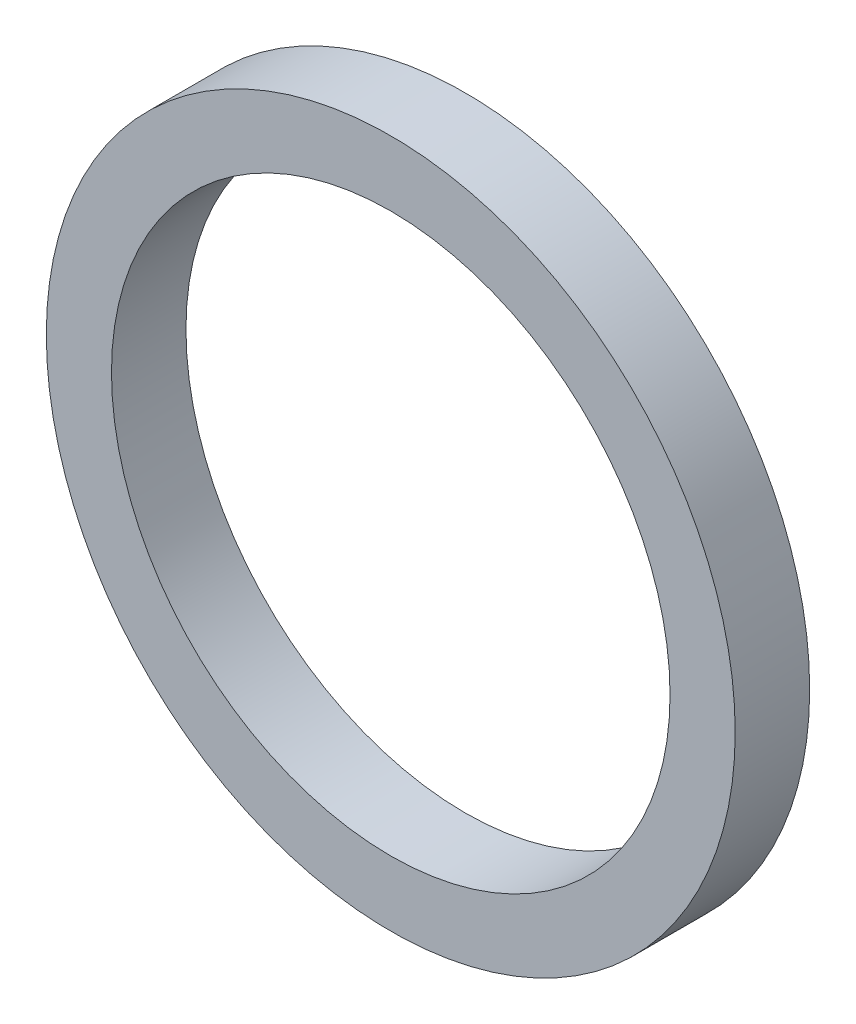
ISO-10303-21;
HEADER;
FILE_DESCRIPTION(('STEP AP214'),'2;1');
FILE_NAME('part.step','',(''),(''),'','','');
FILE_SCHEMA(('AUTOMOTIVE_DESIGN { 1 0 10303 214 1 1 1 1 }'));
ENDSEC;
DATA;
#1=APPLICATION_CONTEXT('core data for automotive mechanical design processes');
#2=APPLICATION_PROTOCOL_DEFINITION('international standard','automotive_design',2000,#1);
#3=PRODUCT_CONTEXT('',#1,'mechanical');
#4=PRODUCT('Part','Part','',(#3));
#5=PRODUCT_RELATED_PRODUCT_CATEGORY('part','',(#4));
#6=PRODUCT_DEFINITION_FORMATION('','',#4);
#7=PRODUCT_DEFINITION_CONTEXT('part definition',#1,'design');
#8=PRODUCT_DEFINITION('design','',#6,#7);
#9=PRODUCT_DEFINITION_SHAPE('','',#8);
#10=(LENGTH_UNIT() NAMED_UNIT(*) SI_UNIT(.MILLI.,.METRE.));
#11=(NAMED_UNIT(*) PLANE_ANGLE_UNIT() SI_UNIT($,.RADIAN.));
#12=(NAMED_UNIT(*) SI_UNIT($,.STERADIAN.) SOLID_ANGLE_UNIT());
#13=UNCERTAINTY_MEASURE_WITH_UNIT(LENGTH_MEASURE(1.E-05),#10,'distance_accuracy_value','');
#14=(GEOMETRIC_REPRESENTATION_CONTEXT(3) GLOBAL_UNCERTAINTY_ASSIGNED_CONTEXT((#13)) GLOBAL_UNIT_ASSIGNED_CONTEXT((#10,
#11,#12)) REPRESENTATION_CONTEXT('',''));
#15=CARTESIAN_POINT('',(0.,0.,0.));
#16=DIRECTION('',(0.,0.,1.));
#17=DIRECTION('',(1.,0.,0.));
#18=AXIS2_PLACEMENT_3D('',#15,#16,#17);
#19=CARTESIAN_POINT('',(0.,0.,4.));
#20=DIRECTION('',(0.,0.,1.));
#21=DIRECTION('',(1.,0.,0.));
#22=AXIS2_PLACEMENT_3D('',#19,#20,#21);
#23=PLANE('',#22);
#24=CARTESIAN_POINT('',(0.,0.,4.));
#25=DIRECTION('',(0.,0.,1.));
#26=DIRECTION('',(1.,0.,0.));
#27=AXIS2_PLACEMENT_3D('',#24,#25,#26);
#28=CIRCLE('',#27,18.5);
#29=CARTESIAN_POINT('',(18.5,0.,4.));
#30=VERTEX_POINT('',#29);
#31=EDGE_CURVE('E10',#30,#30,#28,.T.);
#32=ORIENTED_EDGE('',*,*,#31,.T.);
#33=EDGE_LOOP('',(#32));
#34=FACE_BOUND('',#33,.T.);
#35=CARTESIAN_POINT('',(0.,0.,4.));
#36=DIRECTION('',(0.,0.,1.));
#37=DIRECTION('',(1.,0.,0.));
#38=AXIS2_PLACEMENT_3D('',#35,#36,#37);
#39=CIRCLE('',#38,15.);
#40=CARTESIAN_POINT('',(15.,0.,4.));
#41=VERTEX_POINT('',#40);
#42=EDGE_CURVE('E51',#41,#41,#39,.T.);
#43=ORIENTED_EDGE('',*,*,#42,.F.);
#44=EDGE_LOOP('',(#43));
#45=FACE_BOUND('',#44,.T.);
#46=ADVANCED_FACE('F40',(#34,#45),#23,.T.);
#47=CARTESIAN_POINT('',(0.,0.,0.));
#48=DIRECTION('',(0.,0.,1.));
#49=DIRECTION('',(1.,0.,0.));
#50=AXIS2_PLACEMENT_3D('',#47,#48,#49);
#51=PLANE('',#50);
#52=CARTESIAN_POINT('',(0.,0.,0.));
#53=DIRECTION('',(0.,0.,1.));
#54=DIRECTION('',(1.,0.,0.));
#55=AXIS2_PLACEMENT_3D('',#52,#53,#54);
#56=CIRCLE('',#55,18.5);
#57=CARTESIAN_POINT('',(18.5,0.,0.));
#58=VERTEX_POINT('',#57);
#59=EDGE_CURVE('E44',#58,#58,#56,.T.);
#60=ORIENTED_EDGE('',*,*,#59,.F.);
#61=EDGE_LOOP('',(#60));
#62=FACE_BOUND('',#61,.T.);
#63=CARTESIAN_POINT('',(0.,0.,0.));
#64=DIRECTION('',(0.,0.,1.));
#65=DIRECTION('',(1.,0.,0.));
#66=AXIS2_PLACEMENT_3D('',#63,#64,#65);
#67=CIRCLE('',#66,15.);
#68=CARTESIAN_POINT('',(15.,0.,0.));
#69=VERTEX_POINT('',#68);
#70=EDGE_CURVE('E53',#69,#69,#67,.T.);
#71=ORIENTED_EDGE('',*,*,#70,.T.);
#72=EDGE_LOOP('',(#71));
#73=FACE_BOUND('',#72,.T.);
#74=ADVANCED_FACE('F63',(#62,#73),#51,.F.);
#75=CARTESIAN_POINT('',(0.,0.,4.));
#76=DIRECTION('',(0.,0.,-1.));
#77=DIRECTION('',(-1.,0.,0.));
#78=AXIS2_PLACEMENT_3D('',#75,#76,#77);
#79=CYLINDRICAL_SURFACE('',#78,18.5);
#80=ORIENTED_EDGE('',*,*,#31,.F.);
#81=EDGE_LOOP('',(#80));
#82=FACE_BOUND('',#81,.T.);
#83=ORIENTED_EDGE('',*,*,#59,.T.);
#84=EDGE_LOOP('',(#83));
#85=FACE_BOUND('',#84,.T.);
#86=ADVANCED_FACE('F42',(#82,#85),#79,.T.);
#87=CARTESIAN_POINT('',(0.,0.,4.));
#88=DIRECTION('',(0.,0.,-1.));
#89=DIRECTION('',(-1.,0.,0.));
#90=AXIS2_PLACEMENT_3D('',#87,#88,#89);
#91=CYLINDRICAL_SURFACE('',#90,15.);
#92=ORIENTED_EDGE('',*,*,#42,.T.);
#93=EDGE_LOOP('',(#92));
#94=FACE_BOUND('',#93,.T.);
#95=ORIENTED_EDGE('',*,*,#70,.F.);
#96=EDGE_LOOP('',(#95));
#97=FACE_BOUND('',#96,.T.);
#98=ADVANCED_FACE('F59',(#94,#97),#91,.F.);
#99=CLOSED_SHELL('',(#46,#74,#86,#98));
#100=MANIFOLD_SOLID_BREP('B2',#99);
#101=ADVANCED_BREP_SHAPE_REPRESENTATION('',(#18,#100),#14);
#102=SHAPE_DEFINITION_REPRESENTATION(#9,#101);
ENDSEC;
END-ISO-10303-21;
